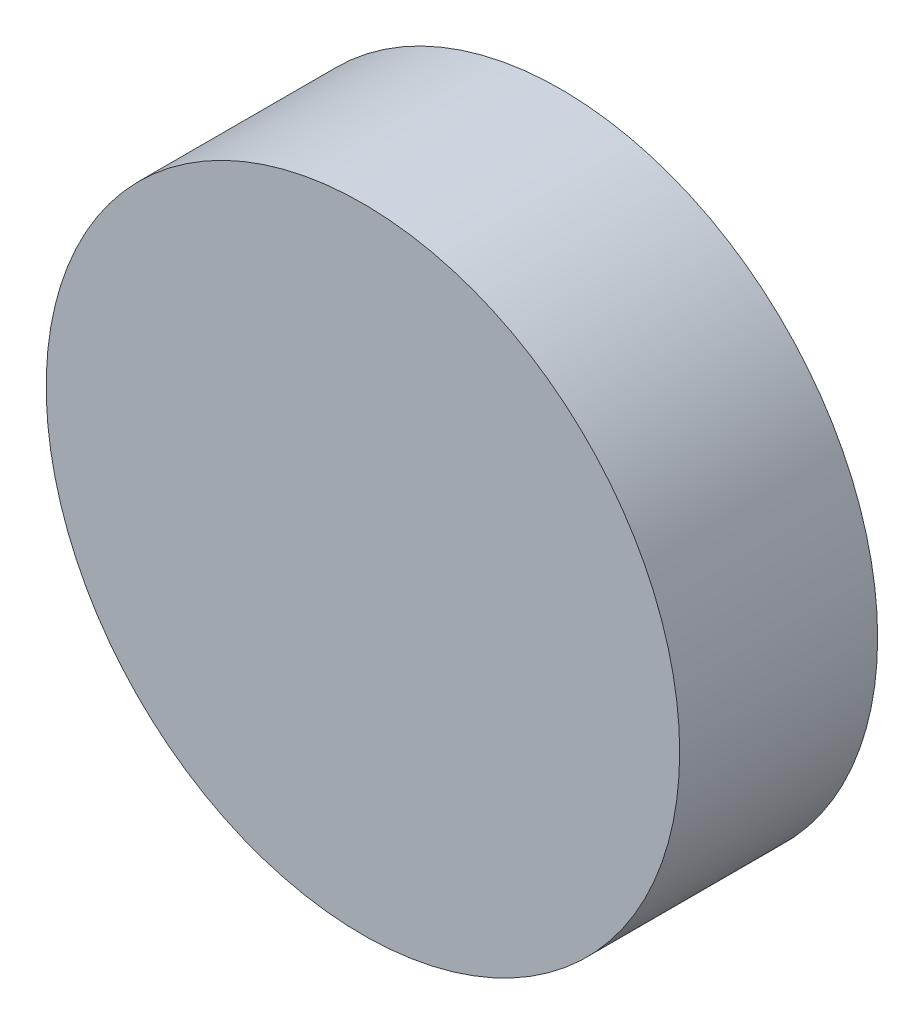
ISO-10303-21;
HEADER;
FILE_DESCRIPTION(('STEP AP214'),'2;1');
FILE_NAME('part.step','',(''),(''),'','','');
FILE_SCHEMA(('AUTOMOTIVE_DESIGN { 1 0 10303 214 1 1 1 1 }'));
ENDSEC;
DATA;
#1=APPLICATION_CONTEXT('core data for automotive mechanical design processes');
#2=APPLICATION_PROTOCOL_DEFINITION('international standard','automotive_design',2000,#1);
#3=PRODUCT_CONTEXT('',#1,'mechanical');
#4=PRODUCT('Part','Part','',(#3));
#5=PRODUCT_RELATED_PRODUCT_CATEGORY('part','',(#4));
#6=PRODUCT_DEFINITION_FORMATION('','',#4);
#7=PRODUCT_DEFINITION_CONTEXT('part definition',#1,'design');
#8=PRODUCT_DEFINITION('design','',#6,#7);
#9=PRODUCT_DEFINITION_SHAPE('','',#8);
#10=(LENGTH_UNIT() NAMED_UNIT(*) SI_UNIT(.MILLI.,.METRE.));
#11=(NAMED_UNIT(*) PLANE_ANGLE_UNIT() SI_UNIT($,.RADIAN.));
#12=(NAMED_UNIT(*) SI_UNIT($,.STERADIAN.) SOLID_ANGLE_UNIT());
#13=UNCERTAINTY_MEASURE_WITH_UNIT(LENGTH_MEASURE(1.E-05),#10,'distance_accuracy_value','');
#14=(GEOMETRIC_REPRESENTATION_CONTEXT(3) GLOBAL_UNCERTAINTY_ASSIGNED_CONTEXT((#13)) GLOBAL_UNIT_ASSIGNED_CONTEXT((#10,
#11,#12)) REPRESENTATION_CONTEXT('',''));
#15=CARTESIAN_POINT('',(0.,0.,0.));
#16=DIRECTION('',(0.,0.,1.));
#17=DIRECTION('',(1.,0.,0.));
#18=AXIS2_PLACEMENT_3D('',#15,#16,#17);
#19=CARTESIAN_POINT('',(0.,0.,5.));
#20=DIRECTION('',(0.,0.,-1.));
#21=DIRECTION('',(-1.,0.,0.));
#22=AXIS2_PLACEMENT_3D('',#19,#20,#21);
#23=CYLINDRICAL_SURFACE('',#22,8.);
#24=CARTESIAN_POINT('',(0.,0.,5.));
#25=DIRECTION('',(0.,0.,1.));
#26=DIRECTION('',(1.,0.,0.));
#27=AXIS2_PLACEMENT_3D('',#24,#25,#26);
#28=CIRCLE('',#27,8.);
#29=CARTESIAN_POINT('',(8.,0.,5.));
#30=VERTEX_POINT('',#29);
#31=EDGE_CURVE('E10',#30,#30,#28,.T.);
#32=ORIENTED_EDGE('',*,*,#31,.F.);
#33=EDGE_LOOP('',(#32));
#34=FACE_BOUND('',#33,.T.);
#35=CARTESIAN_POINT('',(0.,0.,0.));
#36=DIRECTION('',(0.,0.,1.));
#37=DIRECTION('',(1.,0.,0.));
#38=AXIS2_PLACEMENT_3D('',#35,#36,#37);
#39=CIRCLE('',#38,8.);
#40=CARTESIAN_POINT('',(8.,0.,0.));
#41=VERTEX_POINT('',#40);
#42=EDGE_CURVE('E34',#41,#41,#39,.T.);
#43=ORIENTED_EDGE('',*,*,#42,.T.);
#44=EDGE_LOOP('',(#43));
#45=FACE_BOUND('',#44,.T.);
#46=ADVANCED_FACE('F31',(#34,#45),#23,.T.);
#47=CARTESIAN_POINT('',(0.,0.,5.));
#48=DIRECTION('',(0.,0.,1.));
#49=DIRECTION('',(1.,0.,0.));
#50=AXIS2_PLACEMENT_3D('',#47,#48,#49);
#51=PLANE('',#50);
#52=ORIENTED_EDGE('',*,*,#31,.T.);
#53=EDGE_LOOP('',(#52));
#54=FACE_BOUND('',#53,.T.);
#55=ADVANCED_FACE('F46',(#54),#51,.T.);
#56=CARTESIAN_POINT('',(0.,0.,0.));
#57=DIRECTION('',(0.,0.,1.));
#58=DIRECTION('',(1.,0.,0.));
#59=AXIS2_PLACEMENT_3D('',#56,#57,#58);
#60=PLANE('',#59);
#61=ORIENTED_EDGE('',*,*,#42,.F.);
#62=EDGE_LOOP('',(#61));
#63=FACE_BOUND('',#62,.T.);
#64=ADVANCED_FACE('F44',(#63),#60,.F.);
#65=CLOSED_SHELL('',(#46,#55,#64));
#66=MANIFOLD_SOLID_BREP('B2',#65);
#67=ADVANCED_BREP_SHAPE_REPRESENTATION('',(#18,#66),#14);
#68=SHAPE_DEFINITION_REPRESENTATION(#9,#67);
ENDSEC;
END-ISO-10303-21;
